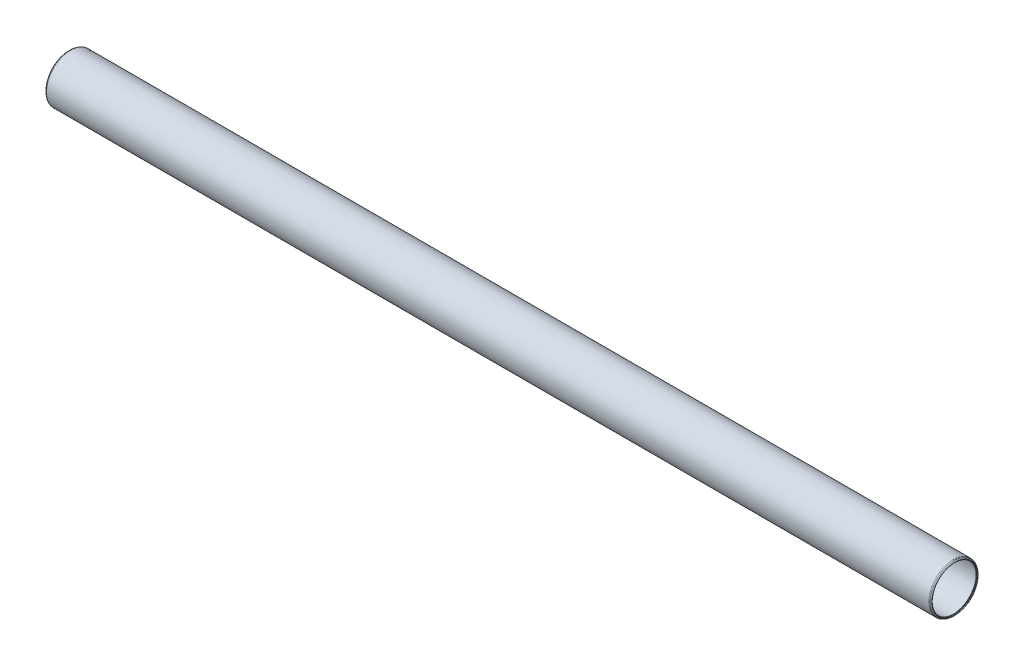
ISO-10303-21;
HEADER;
FILE_DESCRIPTION(('STEP AP214'),'2;1');
FILE_NAME('part.step','',(''),(''),'','','');
FILE_SCHEMA(('AUTOMOTIVE_DESIGN { 1 0 10303 214 1 1 1 1 }'));
ENDSEC;
DATA;
#1=APPLICATION_CONTEXT('core data for automotive mechanical design processes');
#2=APPLICATION_PROTOCOL_DEFINITION('international standard','automotive_design',2000,#1);
#3=PRODUCT_CONTEXT('',#1,'mechanical');
#4=PRODUCT('Part','Part','',(#3));
#5=PRODUCT_RELATED_PRODUCT_CATEGORY('part','',(#4));
#6=PRODUCT_DEFINITION_FORMATION('','',#4);
#7=PRODUCT_DEFINITION_CONTEXT('part definition',#1,'design');
#8=PRODUCT_DEFINITION('design','',#6,#7);
#9=PRODUCT_DEFINITION_SHAPE('','',#8);
#10=(LENGTH_UNIT() NAMED_UNIT(*) SI_UNIT(.MILLI.,.METRE.));
#11=(NAMED_UNIT(*) PLANE_ANGLE_UNIT() SI_UNIT($,.RADIAN.));
#12=(NAMED_UNIT(*) SI_UNIT($,.STERADIAN.) SOLID_ANGLE_UNIT());
#13=UNCERTAINTY_MEASURE_WITH_UNIT(LENGTH_MEASURE(1.E-05),#10,'distance_accuracy_value','');
#14=(GEOMETRIC_REPRESENTATION_CONTEXT(3) GLOBAL_UNCERTAINTY_ASSIGNED_CONTEXT((#13)) GLOBAL_UNIT_ASSIGNED_CONTEXT((#10,
#11,#12)) REPRESENTATION_CONTEXT('',''));
#15=CARTESIAN_POINT('',(0.,0.,0.));
#16=DIRECTION('',(0.,0.,1.));
#17=DIRECTION('',(1.,0.,0.));
#18=AXIS2_PLACEMENT_3D('',#15,#16,#17);
#19=CARTESIAN_POINT('',(718.8835,0.,0.));
#20=DIRECTION('',(-1.,0.,0.));
#21=DIRECTION('',(0.,0.,1.));
#22=AXIS2_PLACEMENT_3D('',#19,#20,#21);
#23=CYLINDRICAL_SURFACE('',#22,19.19605);
#24=CARTESIAN_POINT('',(1.01600000000002,0.,0.));
#25=DIRECTION('',(1.,0.,0.));
#26=DIRECTION('',(0.,0.,-1.));
#27=AXIS2_PLACEMENT_3D('',#24,#25,#26);
#28=CIRCLE('',#27,19.19605);
#29=CARTESIAN_POINT('',(1.01600000000002,0.,-19.19605));
#30=VERTEX_POINT('',#29);
#31=EDGE_CURVE('E117',#30,#30,#28,.F.);
#32=ORIENTED_EDGE('',*,*,#31,.T.);
#33=EDGE_LOOP('',(#32));
#34=FACE_BOUND('',#33,.T.);
#35=CARTESIAN_POINT('',(717.8675,0.,0.));
#36=DIRECTION('',(-1.,0.,0.));
#37=DIRECTION('',(0.,0.,1.));
#38=AXIS2_PLACEMENT_3D('',#35,#36,#37);
#39=CIRCLE('',#38,19.19605);
#40=CARTESIAN_POINT('',(717.8675,0.,19.19605));
#41=VERTEX_POINT('',#40);
#42=EDGE_CURVE('E112',#41,#41,#39,.F.);
#43=ORIENTED_EDGE('',*,*,#42,.T.);
#44=EDGE_LOOP('',(#43));
#45=FACE_BOUND('',#44,.T.);
#46=ADVANCED_FACE('F15',(#34,#45),#23,.F.);
#47=CARTESIAN_POINT('',(1.01600000000002,0.,0.));
#48=DIRECTION('',(1.,0.,0.));
#49=DIRECTION('',(0.,0.,-1.));
#50=AXIS2_PLACEMENT_3D('',#47,#48,#49);
#51=CONICAL_SURFACE('',#50,19.19605,0.78539816339744);
#52=CARTESIAN_POINT('',(0.,0.,0.));
#53=DIRECTION('',(-1.,0.,0.));
#54=DIRECTION('',(0.,0.,1.));
#55=AXIS2_PLACEMENT_3D('',#52,#53,#54);
#56=CIRCLE('',#55,18.18005);
#57=CARTESIAN_POINT('',(0.,0.,18.18005));
#58=VERTEX_POINT('',#57);
#59=EDGE_CURVE('E107',#58,#58,#56,.T.);
#60=ORIENTED_EDGE('',*,*,#59,.T.);
#61=EDGE_LOOP('',(#60));
#62=FACE_BOUND('',#61,.T.);
#63=ORIENTED_EDGE('',*,*,#31,.F.);
#64=EDGE_LOOP('',(#63));
#65=FACE_BOUND('',#64,.T.);
#66=ADVANCED_FACE('F124',(#62,#65),#51,.F.);
#67=CARTESIAN_POINT('',(717.8675,0.,0.));
#68=DIRECTION('',(-1.,0.,0.));
#69=DIRECTION('',(0.,0.,1.));
#70=AXIS2_PLACEMENT_3D('',#67,#68,#69);
#71=CONICAL_SURFACE('',#70,19.19605,0.785398163397445);
#72=ORIENTED_EDGE('',*,*,#42,.F.);
#73=EDGE_LOOP('',(#72));
#74=FACE_BOUND('',#73,.T.);
#75=CARTESIAN_POINT('',(718.8835,0.,0.));
#76=DIRECTION('',(-1.,0.,0.));
#77=DIRECTION('',(0.,0.,1.));
#78=AXIS2_PLACEMENT_3D('',#75,#76,#77);
#79=CIRCLE('',#78,18.18005);
#80=CARTESIAN_POINT('',(718.8835,0.,18.18005));
#81=VERTEX_POINT('',#80);
#82=EDGE_CURVE('E102',#81,#81,#79,.F.);
#83=ORIENTED_EDGE('',*,*,#82,.T.);
#84=EDGE_LOOP('',(#83));
#85=FACE_BOUND('',#84,.T.);
#86=ADVANCED_FACE('F126',(#74,#85),#71,.F.);
#87=CARTESIAN_POINT('',(718.8835,0.,0.));
#88=DIRECTION('',(-1.,0.,0.));
#89=DIRECTION('',(0.,0.,1.));
#90=AXIS2_PLACEMENT_3D('',#87,#88,#89);
#91=CYLINDRICAL_SURFACE('',#90,18.18005);
#92=CARTESIAN_POINT('',(-0.507999999999953,0.,0.));
#93=DIRECTION('',(-1.,0.,0.));
#94=DIRECTION('',(0.,0.,1.));
#95=AXIS2_PLACEMENT_3D('',#92,#93,#94);
#96=CIRCLE('',#95,18.18005);
#97=CARTESIAN_POINT('',(-0.507999999999954,0.,18.18005));
#98=VERTEX_POINT('',#97);
#99=EDGE_CURVE('E97',#98,#98,#96,.T.);
#100=ORIENTED_EDGE('',*,*,#99,.T.);
#101=EDGE_LOOP('',(#100));
#102=FACE_BOUND('',#101,.T.);
#103=ORIENTED_EDGE('',*,*,#59,.F.);
#104=EDGE_LOOP('',(#103));
#105=FACE_BOUND('',#104,.T.);
#106=ADVANCED_FACE('F133',(#102,#105),#91,.F.);
#107=CARTESIAN_POINT('',(718.8835,0.,0.));
#108=DIRECTION('',(-1.,0.,0.));
#109=DIRECTION('',(0.,0.,1.));
#110=AXIS2_PLACEMENT_3D('',#107,#108,#109);
#111=CYLINDRICAL_SURFACE('',#110,18.18005);
#112=ORIENTED_EDGE('',*,*,#82,.F.);
#113=EDGE_LOOP('',(#112));
#114=FACE_BOUND('',#113,.T.);
#115=CARTESIAN_POINT('',(719.3915,0.,0.));
#116=DIRECTION('',(1.,0.,0.));
#117=DIRECTION('',(0.,0.,-1.));
#118=AXIS2_PLACEMENT_3D('',#115,#116,#117);
#119=CIRCLE('',#118,18.18005);
#120=CARTESIAN_POINT('',(719.3915,0.,-18.18005));
#121=VERTEX_POINT('',#120);
#122=EDGE_CURVE('E92',#121,#121,#119,.T.);
#123=ORIENTED_EDGE('',*,*,#122,.T.);
#124=EDGE_LOOP('',(#123));
#125=FACE_BOUND('',#124,.T.);
#126=ADVANCED_FACE('F153',(#114,#125),#111,.F.);
#127=CARTESIAN_POINT('',(-0.882617928474882,0.,0.));
#128=DIRECTION('',(-1.,0.,0.));
#129=DIRECTION('',(0.,0.,1.));
#130=AXIS2_PLACEMENT_3D('',#127,#128,#129);
#131=CONICAL_SURFACE('',#130,18.5546679284748,0.785398163397328);
#132=CARTESIAN_POINT('',(-0.882617928474858,0.,0.));
#133=DIRECTION('',(1.,0.,0.));
#134=DIRECTION('',(0.,0.,-1.));
#135=AXIS2_PLACEMENT_3D('',#132,#133,#134);
#136=CIRCLE('',#135,18.5546679284749);
#137=CARTESIAN_POINT('',(-0.882617928474858,0.,-18.5546679284749));
#138=VERTEX_POINT('',#137);
#139=EDGE_CURVE('E89',#138,#138,#136,.T.);
#140=ORIENTED_EDGE('',*,*,#139,.F.);
#141=EDGE_LOOP('',(#140));
#142=FACE_BOUND('',#141,.T.);
#143=ORIENTED_EDGE('',*,*,#99,.F.);
#144=EDGE_LOOP('',(#143));
#145=FACE_BOUND('',#144,.T.);
#146=ADVANCED_FACE('F150',(#142,#145),#131,.F.);
#147=CARTESIAN_POINT('',(719.766117928475,0.,0.));
#148=DIRECTION('',(1.,0.,0.));
#149=DIRECTION('',(0.,0.,-1.));
#150=AXIS2_PLACEMENT_3D('',#147,#148,#149);
#151=CONICAL_SURFACE('',#150,18.5546679284745,0.785398163397421);
#152=ORIENTED_EDGE('',*,*,#122,.F.);
#153=EDGE_LOOP('',(#152));
#154=FACE_BOUND('',#153,.T.);
#155=CARTESIAN_POINT('',(719.766117928475,0.,0.));
#156=DIRECTION('',(1.,0.,0.));
#157=DIRECTION('',(0.,0.,-1.));
#158=AXIS2_PLACEMENT_3D('',#155,#156,#157);
#159=CIRCLE('',#158,18.5546679284743);
#160=CARTESIAN_POINT('',(719.766117928475,0.,-18.5546679284743));
#161=VERTEX_POINT('',#160);
#162=EDGE_CURVE('E67',#161,#161,#159,.F.);
#163=ORIENTED_EDGE('',*,*,#162,.F.);
#164=EDGE_LOOP('',(#163));
#165=FACE_BOUND('',#164,.T.);
#166=ADVANCED_FACE('F83',(#154,#165),#151,.F.);
#167=CARTESIAN_POINT('',(-0.792815367264156,0.,0.));
#168=DIRECTION('',(1.,0.,0.));
#169=DIRECTION('',(0.,0.,-1.));
#170=AXIS2_PLACEMENT_3D('',#167,#168,#169);
#171=TOROIDAL_SURFACE('',#170,18.6444704896855,0.126999999999997);
#172=CARTESIAN_POINT('',(-0.882617928474883,0.,0.));
#173=DIRECTION('',(1.,0.,0.));
#174=DIRECTION('',(0.,0.,-1.));
#175=AXIS2_PLACEMENT_3D('',#172,#173,#174);
#176=CIRCLE('',#175,18.7342730508962);
#177=CARTESIAN_POINT('',(-0.882617928474881,0.,-18.7342730508962));
#178=VERTEX_POINT('',#177);
#179=EDGE_CURVE('E62',#178,#178,#176,.T.);
#180=ORIENTED_EDGE('',*,*,#179,.F.);
#181=EDGE_LOOP('',(#180));
#182=FACE_BOUND('',#181,.T.);
#183=ORIENTED_EDGE('',*,*,#139,.T.);
#184=EDGE_LOOP('',(#183));
#185=FACE_BOUND('',#184,.T.);
#186=ADVANCED_FACE('F78',(#182,#185),#171,.T.);
#187=CARTESIAN_POINT('',(719.676315367264,0.,0.));
#188=DIRECTION('',(1.,0.,0.));
#189=DIRECTION('',(0.,0.,-1.));
#190=AXIS2_PLACEMENT_3D('',#187,#188,#189);
#191=TOROIDAL_SURFACE('',#190,18.6444704896855,0.127000000000126);
#192=ORIENTED_EDGE('',*,*,#162,.T.);
#193=EDGE_LOOP('',(#192));
#194=FACE_BOUND('',#193,.T.);
#195=CARTESIAN_POINT('',(719.766117928474,0.,0.));
#196=DIRECTION('',(-1.,0.,0.));
#197=DIRECTION('',(0.,0.,1.));
#198=AXIS2_PLACEMENT_3D('',#195,#196,#197);
#199=CIRCLE('',#198,18.7342730508963);
#200=CARTESIAN_POINT('',(719.766117928474,0.,18.7342730508963));
#201=VERTEX_POINT('',#200);
#202=EDGE_CURVE('E57',#201,#201,#199,.T.);
#203=ORIENTED_EDGE('',*,*,#202,.F.);
#204=EDGE_LOOP('',(#203));
#205=FACE_BOUND('',#204,.T.);
#206=ADVANCED_FACE('F74',(#194,#205),#191,.T.);
#207=CARTESIAN_POINT('',(-0.146920489685562,0.,0.));
#208=DIRECTION('',(1.,0.,0.));
#209=DIRECTION('',(0.,0.,-1.));
#210=AXIS2_PLACEMENT_3D('',#207,#208,#209);
#211=CONICAL_SURFACE('',#210,19.4699704896855,0.785398163397442);
#212=CARTESIAN_POINT('',(-0.146920489685543,0.,0.));
#213=DIRECTION('',(1.,0.,0.));
#214=DIRECTION('',(0.,0.,-1.));
#215=AXIS2_PLACEMENT_3D('',#212,#213,#214);
#216=CIRCLE('',#215,19.4699704896855);
#217=CARTESIAN_POINT('',(-0.146920489685543,0.,-19.4699704896855));
#218=VERTEX_POINT('',#217);
#219=EDGE_CURVE('E54',#218,#218,#216,.T.);
#220=ORIENTED_EDGE('',*,*,#219,.F.);
#221=EDGE_LOOP('',(#220));
#222=FACE_BOUND('',#221,.T.);
#223=ORIENTED_EDGE('',*,*,#179,.T.);
#224=EDGE_LOOP('',(#223));
#225=FACE_BOUND('',#224,.T.);
#226=ADVANCED_FACE('F77',(#222,#225),#211,.T.);
#227=CARTESIAN_POINT('',(719.030420489686,0.,0.));
#228=DIRECTION('',(-1.,0.,0.));
#229=DIRECTION('',(0.,0.,1.));
#230=AXIS2_PLACEMENT_3D('',#227,#228,#229);
#231=CONICAL_SURFACE('',#230,19.4699704896847,0.785398163397373);
#232=ORIENTED_EDGE('',*,*,#202,.T.);
#233=EDGE_LOOP('',(#232));
#234=FACE_BOUND('',#233,.T.);
#235=CARTESIAN_POINT('',(719.030420489686,0.,0.));
#236=DIRECTION('',(1.,0.,0.));
#237=DIRECTION('',(0.,0.,-1.));
#238=AXIS2_PLACEMENT_3D('',#235,#236,#237);
#239=CIRCLE('',#238,19.469970489685);
#240=CARTESIAN_POINT('',(719.030420489686,0.,-19.469970489685));
#241=VERTEX_POINT('',#240);
#242=EDGE_CURVE('E27',#241,#241,#239,.F.);
#243=ORIENTED_EDGE('',*,*,#242,.F.);
#244=EDGE_LOOP('',(#243));
#245=FACE_BOUND('',#244,.T.);
#246=ADVANCED_FACE('F48',(#234,#245),#231,.T.);
#247=CARTESIAN_POINT('',(0.571500000000008,0.,0.));
#248=DIRECTION('',(1.,0.,0.));
#249=DIRECTION('',(0.,0.,-1.));
#250=AXIS2_PLACEMENT_3D('',#247,#248,#249);
#251=TOROIDAL_SURFACE('',#250,18.75155,1.01600000000002);
#252=CARTESIAN_POINT('',(0.571500000000058,0.,0.));
#253=DIRECTION('',(-1.,0.,0.));
#254=DIRECTION('',(0.,0.,1.));
#255=AXIS2_PLACEMENT_3D('',#252,#253,#254);
#256=CIRCLE('',#255,19.76755);
#257=CARTESIAN_POINT('',(0.571500000000058,0.,19.76755));
#258=VERTEX_POINT('',#257);
#259=EDGE_CURVE('E22',#258,#258,#256,.F.);
#260=ORIENTED_EDGE('',*,*,#259,.F.);
#261=EDGE_LOOP('',(#260));
#262=FACE_BOUND('',#261,.T.);
#263=ORIENTED_EDGE('',*,*,#219,.T.);
#264=EDGE_LOOP('',(#263));
#265=FACE_BOUND('',#264,.T.);
#266=ADVANCED_FACE('F43',(#262,#265),#251,.T.);
#267=CARTESIAN_POINT('',(718.312,0.,0.));
#268=DIRECTION('',(1.,0.,0.));
#269=DIRECTION('',(0.,0.,-1.));
#270=AXIS2_PLACEMENT_3D('',#267,#268,#269);
#271=TOROIDAL_SURFACE('',#270,18.7515499999999,1.01599999999998);
#272=ORIENTED_EDGE('',*,*,#242,.T.);
#273=EDGE_LOOP('',(#272));
#274=FACE_BOUND('',#273,.T.);
#275=CARTESIAN_POINT('',(718.312,0.,0.));
#276=DIRECTION('',(-1.,0.,0.));
#277=DIRECTION('',(0.,0.,1.));
#278=AXIS2_PLACEMENT_3D('',#275,#276,#277);
#279=CIRCLE('',#278,19.76755);
#280=CARTESIAN_POINT('',(718.312,0.,19.76755));
#281=VERTEX_POINT('',#280);
#282=EDGE_CURVE('E10',#281,#281,#279,.T.);
#283=ORIENTED_EDGE('',*,*,#282,.F.);
#284=EDGE_LOOP('',(#283));
#285=FACE_BOUND('',#284,.T.);
#286=ADVANCED_FACE('F38',(#274,#285),#271,.T.);
#287=CARTESIAN_POINT('',(718.8835,0.,0.));
#288=DIRECTION('',(-1.,0.,0.));
#289=DIRECTION('',(0.,0.,1.));
#290=AXIS2_PLACEMENT_3D('',#287,#288,#289);
#291=CYLINDRICAL_SURFACE('',#290,19.76755);
#292=ORIENTED_EDGE('',*,*,#282,.T.);
#293=EDGE_LOOP('',(#292));
#294=FACE_BOUND('',#293,.T.);
#295=ORIENTED_EDGE('',*,*,#259,.T.);
#296=EDGE_LOOP('',(#295));
#297=FACE_BOUND('',#296,.T.);
#298=ADVANCED_FACE('F42',(#294,#297),#291,.T.);
#299=CLOSED_SHELL('',(#46,#66,#86,#106,#126,#146,#166,#186,#206,#226,#246,#266,#286,#298));
#300=MANIFOLD_SOLID_BREP('B1',#299);
#301=ADVANCED_BREP_SHAPE_REPRESENTATION('',(#18,#300),#14);
#302=SHAPE_DEFINITION_REPRESENTATION(#9,#301);
ENDSEC;
END-ISO-10303-21;
